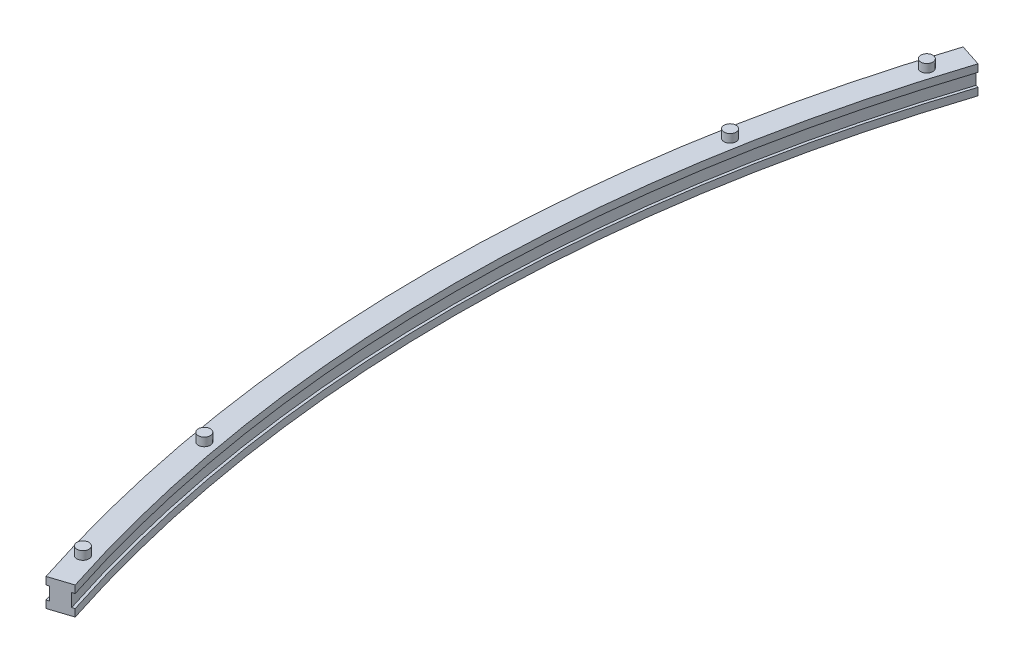
ISO-10303-21;
HEADER;
FILE_DESCRIPTION(('STEP AP214'),'2;1');
FILE_NAME('part.step','',(''),(''),'','','');
FILE_SCHEMA(('AUTOMOTIVE_DESIGN { 1 0 10303 214 1 1 1 1 }'));
ENDSEC;
DATA;
#1=APPLICATION_CONTEXT('core data for automotive mechanical design processes');
#2=APPLICATION_PROTOCOL_DEFINITION('international standard','automotive_design',2000,#1);
#3=PRODUCT_CONTEXT('',#1,'mechanical');
#4=PRODUCT('Part','Part','',(#3));
#5=PRODUCT_RELATED_PRODUCT_CATEGORY('part','',(#4));
#6=PRODUCT_DEFINITION_FORMATION('','',#4);
#7=PRODUCT_DEFINITION_CONTEXT('part definition',#1,'design');
#8=PRODUCT_DEFINITION('design','',#6,#7);
#9=PRODUCT_DEFINITION_SHAPE('','',#8);
#10=(LENGTH_UNIT() NAMED_UNIT(*) SI_UNIT(.MILLI.,.METRE.));
#11=(NAMED_UNIT(*) PLANE_ANGLE_UNIT() SI_UNIT($,.RADIAN.));
#12=(NAMED_UNIT(*) SI_UNIT($,.STERADIAN.) SOLID_ANGLE_UNIT());
#13=UNCERTAINTY_MEASURE_WITH_UNIT(LENGTH_MEASURE(1.E-05),#10,'distance_accuracy_value','');
#14=(GEOMETRIC_REPRESENTATION_CONTEXT(3) GLOBAL_UNCERTAINTY_ASSIGNED_CONTEXT((#13)) GLOBAL_UNIT_ASSIGNED_CONTEXT((#10,
#11,#12)) REPRESENTATION_CONTEXT('',''));
#15=CARTESIAN_POINT('',(0.,0.,0.));
#16=DIRECTION('',(0.,0.,1.));
#17=DIRECTION('',(1.,0.,0.));
#18=AXIS2_PLACEMENT_3D('',#15,#16,#17);
#19=CARTESIAN_POINT('',(0.,0.8,0.));
#20=DIRECTION('',(0.,1.,0.));
#21=DIRECTION('',(0.,0.,1.));
#22=AXIS2_PLACEMENT_3D('',#19,#20,#21);
#23=PLANE('',#22);
#24=CARTESIAN_POINT('',(0.,0.8,0.));
#25=DIRECTION('',(0.,-1.,0.));
#26=DIRECTION('',(0.,0.,1.));
#27=AXIS2_PLACEMENT_3D('',#24,#25,#26);
#28=CIRCLE('',#27,157.905734252812);
#29=CARTESIAN_POINT('',(-150.177277521508,0.8,48.7955553933733));
#30=VERTEX_POINT('',#29);
#31=CARTESIAN_POINT('',(-150.177277521508,0.8,-48.7955553933733));
#32=VERTEX_POINT('',#31);
#33=EDGE_CURVE('E52',#30,#32,#28,.T.);
#34=ORIENTED_EDGE('',*,*,#33,.F.);
#35=DIRECTION('',(-0.951056516295153,0.,0.309016994374949));
#36=VECTOR('',#35,1.);
#37=CARTESIAN_POINT('',(0.,0.8,0.));
#38=LINE('',#37,#36);
#39=CARTESIAN_POINT('',(-149.891960566619,0.8,48.7028502950608));
#40=VERTEX_POINT('',#39);
#41=EDGE_CURVE('E189',#40,#30,#38,.T.);
#42=ORIENTED_EDGE('',*,*,#41,.F.);
#43=CARTESIAN_POINT('',(0.,0.8,0.));
#44=DIRECTION('',(0.,1.,0.));
#45=DIRECTION('',(0.,0.,1.));
#46=AXIS2_PLACEMENT_3D('',#43,#44,#45);
#47=CIRCLE('',#46,157.605734252812);
#48=CARTESIAN_POINT('',(-149.891960566619,0.8,-48.7028502950608));
#49=VERTEX_POINT('',#48);
#50=EDGE_CURVE('E178',#49,#40,#47,.T.);
#51=ORIENTED_EDGE('',*,*,#50,.F.);
#52=DIRECTION('',(-0.951056516295153,0.,-0.309016994374949));
#53=VECTOR('',#52,1.);
#54=CARTESIAN_POINT('',(0.,0.8,0.));
#55=LINE('',#54,#53);
#56=EDGE_CURVE('E183',#49,#32,#55,.T.);
#57=ORIENTED_EDGE('',*,*,#56,.T.);
#58=EDGE_LOOP('',(#34,#42,#51,#57));
#59=FACE_BOUND('',#58,.T.);
#60=ADVANCED_FACE('F35',(#59),#23,.T.);
#61=CARTESIAN_POINT('',(0.,0.8,0.));
#62=DIRECTION('',(0.,-1.,0.));
#63=DIRECTION('',(0.,0.,-1.));
#64=AXIS2_PLACEMENT_3D('',#61,#62,#63);
#65=CYLINDRICAL_SURFACE('',#64,157.605734252812);
#66=CARTESIAN_POINT('',(0.,0.,0.));
#67=DIRECTION('',(0.,1.,0.));
#68=DIRECTION('',(0.,0.,1.));
#69=AXIS2_PLACEMENT_3D('',#66,#67,#68);
#70=CIRCLE('',#69,157.605734252812);
#71=CARTESIAN_POINT('',(-149.891960566619,0.,-48.7028502950608));
#72=VERTEX_POINT('',#71);
#73=CARTESIAN_POINT('',(-149.891960566619,0.,48.7028502950608));
#74=VERTEX_POINT('',#73);
#75=EDGE_CURVE('E177',#72,#74,#70,.T.);
#76=ORIENTED_EDGE('',*,*,#75,.F.);
#77=DIRECTION('',(0.,-1.,0.));
#78=VECTOR('',#77,1.);
#79=CARTESIAN_POINT('',(-149.891960566619,0.8,-48.7028502950608));
#80=LINE('',#79,#78);
#81=EDGE_CURVE('E11',#49,#72,#80,.T.);
#82=ORIENTED_EDGE('',*,*,#81,.F.);
#83=ORIENTED_EDGE('',*,*,#50,.T.);
#84=DIRECTION('',(0.,-1.,0.));
#85=VECTOR('',#84,1.);
#86=CARTESIAN_POINT('',(-149.891960566619,0.8,48.7028502950608));
#87=LINE('',#86,#85);
#88=EDGE_CURVE('E191',#40,#74,#87,.T.);
#89=ORIENTED_EDGE('',*,*,#88,.T.);
#90=EDGE_LOOP('',(#76,#82,#83,#89));
#91=FACE_BOUND('',#90,.T.);
#92=ADVANCED_FACE('F37',(#91),#65,.F.);
#93=CARTESIAN_POINT('',(0.,0.8,0.));
#94=DIRECTION('',(-0.309016994374949,0.,0.951056516295153));
#95=DIRECTION('',(0.951056516295153,0.,0.309016994374949));
#96=AXIS2_PLACEMENT_3D('',#93,#94,#95);
#97=PLANE('',#96);
#98=DIRECTION('',(-0.951056516295153,0.,-0.309016994374949));
#99=VECTOR('',#98,1.);
#100=CARTESIAN_POINT('',(0.,0.,0.));
#101=LINE('',#100,#99);
#102=CARTESIAN_POINT('',(-152.269601857357,0.,-49.4753927809982));
#103=VERTEX_POINT('',#102);
#104=EDGE_CURVE('E194',#72,#103,#101,.T.);
#105=ORIENTED_EDGE('',*,*,#104,.T.);
#106=DIRECTION('',(0.,-1.,0.));
#107=VECTOR('',#106,1.);
#108=CARTESIAN_POINT('',(-152.269601857357,0.8,-49.4753927809982));
#109=LINE('',#108,#107);
#110=CARTESIAN_POINT('',(-152.269601857357,0.8,-49.4753927809982));
#111=VERTEX_POINT('',#110);
#112=EDGE_CURVE('E44',#111,#103,#109,.T.);
#113=ORIENTED_EDGE('',*,*,#112,.F.);
#114=CARTESIAN_POINT('',(-151.984284902468,0.8,-49.3826876826857));
#115=VERTEX_POINT('',#114);
#116=EDGE_CURVE('E181',#115,#111,#55,.T.);
#117=ORIENTED_EDGE('',*,*,#116,.F.);
#118=DIRECTION('',(0.,-1.,0.));
#119=VECTOR('',#118,1.);
#120=CARTESIAN_POINT('',(-151.984284902468,2.2,-49.3826876826857));
#121=LINE('',#120,#119);
#122=CARTESIAN_POINT('',(-151.984284902468,2.2,-49.3826876826857));
#123=VERTEX_POINT('',#122);
#124=EDGE_CURVE('E171',#123,#115,#121,.T.);
#125=ORIENTED_EDGE('',*,*,#124,.F.);
#126=DIRECTION('',(-0.951056516295153,0.,-0.309016994374948));
#127=VECTOR('',#126,1.);
#128=CARTESIAN_POINT('',(-149.891960566619,2.2,-48.7028502950608));
#129=LINE('',#128,#127);
#130=CARTESIAN_POINT('',(-152.269601857357,2.2,-49.4753927809982));
#131=VERTEX_POINT('',#130);
#132=EDGE_CURVE('E234',#123,#131,#129,.T.);
#133=ORIENTED_EDGE('',*,*,#132,.T.);
#134=DIRECTION('',(0.,-1.,0.));
#135=VECTOR('',#134,1.);
#136=CARTESIAN_POINT('',(-152.269601857357,3.,-49.4753927809982));
#137=LINE('',#136,#135);
#138=CARTESIAN_POINT('',(-152.269601857357,3.,-49.4753927809982));
#139=VERTEX_POINT('',#138);
#140=EDGE_CURVE('E134',#139,#131,#137,.T.);
#141=ORIENTED_EDGE('',*,*,#140,.F.);
#142=DIRECTION('',(-0.951056516295153,0.,-0.309016994374948));
#143=VECTOR('',#142,1.);
#144=CARTESIAN_POINT('',(-149.891960566619,3.,-48.7028502950608));
#145=LINE('',#144,#143);
#146=CARTESIAN_POINT('',(-149.891960566619,3.,-48.7028502950608));
#147=VERTEX_POINT('',#146);
#148=EDGE_CURVE('E126',#147,#139,#145,.T.);
#149=ORIENTED_EDGE('',*,*,#148,.F.);
#150=DIRECTION('',(0.,-1.,0.));
#151=VECTOR('',#150,1.);
#152=CARTESIAN_POINT('',(-149.891960566619,3.,-48.7028502950608));
#153=LINE('',#152,#151);
#154=CARTESIAN_POINT('',(-149.891960566619,2.2,-48.7028502950608));
#155=VERTEX_POINT('',#154);
#156=EDGE_CURVE('E131',#147,#155,#153,.T.);
#157=ORIENTED_EDGE('',*,*,#156,.T.);
#158=CARTESIAN_POINT('',(-150.177277521508,2.2,-48.7955553933733));
#159=VERTEX_POINT('',#158);
#160=EDGE_CURVE('E235',#155,#159,#129,.T.);
#161=ORIENTED_EDGE('',*,*,#160,.T.);
#162=DIRECTION('',(0.,-1.,0.));
#163=VECTOR('',#162,1.);
#164=CARTESIAN_POINT('',(-150.177277521508,2.2,-48.7955553933733));
#165=LINE('',#164,#163);
#166=EDGE_CURVE('E174',#159,#32,#165,.T.);
#167=ORIENTED_EDGE('',*,*,#166,.T.);
#168=ORIENTED_EDGE('',*,*,#56,.F.);
#169=ORIENTED_EDGE('',*,*,#81,.T.);
#170=EDGE_LOOP('',(#105,#113,#117,#125,#133,#141,#149,#157,#161,#167,#168,#169));
#171=FACE_BOUND('',#170,.T.);
#172=ADVANCED_FACE('F128',(#171),#97,.F.);
#173=CARTESIAN_POINT('',(0.,0.8,0.));
#174=DIRECTION('',(0.,-1.,0.));
#175=DIRECTION('',(0.,0.,-1.));
#176=AXIS2_PLACEMENT_3D('',#173,#174,#175);
#177=CYLINDRICAL_SURFACE('',#176,160.105734252812);
#178=CARTESIAN_POINT('',(0.,0.,0.));
#179=DIRECTION('',(0.,1.,0.));
#180=DIRECTION('',(0.,0.,1.));
#181=AXIS2_PLACEMENT_3D('',#178,#179,#180);
#182=CIRCLE('',#181,160.105734252812);
#183=CARTESIAN_POINT('',(-152.269601857357,0.,49.4753927809982));
#184=VERTEX_POINT('',#183);
#185=EDGE_CURVE('E196',#103,#184,#182,.T.);
#186=ORIENTED_EDGE('',*,*,#185,.T.);
#187=DIRECTION('',(0.,-1.,0.));
#188=VECTOR('',#187,1.);
#189=CARTESIAN_POINT('',(-152.269601857357,0.8,49.4753927809982));
#190=LINE('',#189,#188);
#191=CARTESIAN_POINT('',(-152.269601857357,0.8,49.4753927809982));
#192=VERTEX_POINT('',#191);
#193=EDGE_CURVE('E202',#192,#184,#190,.T.);
#194=ORIENTED_EDGE('',*,*,#193,.F.);
#195=CARTESIAN_POINT('',(0.,0.8,0.));
#196=DIRECTION('',(0.,1.,0.));
#197=DIRECTION('',(0.,0.,1.));
#198=AXIS2_PLACEMENT_3D('',#195,#196,#197);
#199=CIRCLE('',#198,160.105734252812);
#200=EDGE_CURVE('E185',#111,#192,#199,.T.);
#201=ORIENTED_EDGE('',*,*,#200,.F.);
#202=ORIENTED_EDGE('',*,*,#112,.T.);
#203=EDGE_LOOP('',(#186,#194,#201,#202));
#204=FACE_BOUND('',#203,.T.);
#205=ADVANCED_FACE('F261',(#204),#177,.T.);
#206=CARTESIAN_POINT('',(0.,0.8,0.));
#207=DIRECTION('',(0.309016994374949,0.,0.951056516295153));
#208=DIRECTION('',(0.951056516295153,0.,-0.309016994374949));
#209=AXIS2_PLACEMENT_3D('',#206,#207,#208);
#210=PLANE('',#209);
#211=DIRECTION('',(-0.951056516295153,0.,0.309016994374949));
#212=VECTOR('',#211,1.);
#213=CARTESIAN_POINT('',(0.,0.,0.));
#214=LINE('',#213,#212);
#215=EDGE_CURVE('E182',#74,#184,#214,.T.);
#216=ORIENTED_EDGE('',*,*,#215,.F.);
#217=ORIENTED_EDGE('',*,*,#88,.F.);
#218=ORIENTED_EDGE('',*,*,#41,.T.);
#219=DIRECTION('',(0.,-1.,0.));
#220=VECTOR('',#219,1.);
#221=CARTESIAN_POINT('',(-150.177277521508,2.2,48.7955553933732));
#222=LINE('',#221,#220);
#223=CARTESIAN_POINT('',(-150.177277521508,2.2,48.7955553933732));
#224=VERTEX_POINT('',#223);
#225=EDGE_CURVE('E163',#224,#30,#222,.T.);
#226=ORIENTED_EDGE('',*,*,#225,.F.);
#227=DIRECTION('',(0.951056516295149,0.,-0.30901699437496));
#228=VECTOR('',#227,1.);
#229=CARTESIAN_POINT('',(-152.269601857357,2.2,49.4753927809982));
#230=LINE('',#229,#228);
#231=CARTESIAN_POINT('',(-149.891960566619,2.2,48.7028502950608));
#232=VERTEX_POINT('',#231);
#233=EDGE_CURVE('E239',#224,#232,#230,.T.);
#234=ORIENTED_EDGE('',*,*,#233,.T.);
#235=DIRECTION('',(0.,-1.,0.));
#236=VECTOR('',#235,1.);
#237=CARTESIAN_POINT('',(-149.891960566619,3.,48.7028502950608));
#238=LINE('',#237,#236);
#239=CARTESIAN_POINT('',(-149.891960566619,3.,48.7028502950608));
#240=VERTEX_POINT('',#239);
#241=EDGE_CURVE('E232',#240,#232,#238,.T.);
#242=ORIENTED_EDGE('',*,*,#241,.F.);
#243=DIRECTION('',(0.951056516295149,0.,-0.30901699437496));
#244=VECTOR('',#243,1.);
#245=CARTESIAN_POINT('',(-152.269601857357,3.,49.4753927809982));
#246=LINE('',#245,#244);
#247=CARTESIAN_POINT('',(-152.269601857357,3.,49.4753927809982));
#248=VERTEX_POINT('',#247);
#249=EDGE_CURVE('E143',#248,#240,#246,.T.);
#250=ORIENTED_EDGE('',*,*,#249,.F.);
#251=DIRECTION('',(0.,-1.,0.));
#252=VECTOR('',#251,1.);
#253=CARTESIAN_POINT('',(-152.269601857357,3.,49.4753927809982));
#254=LINE('',#253,#252);
#255=CARTESIAN_POINT('',(-152.269601857357,2.2,49.4753927809982));
#256=VERTEX_POINT('',#255);
#257=EDGE_CURVE('E154',#248,#256,#254,.T.);
#258=ORIENTED_EDGE('',*,*,#257,.T.);
#259=CARTESIAN_POINT('',(-151.984284902468,2.2,49.3826876826857));
#260=VERTEX_POINT('',#259);
#261=EDGE_CURVE('E147',#256,#260,#230,.T.);
#262=ORIENTED_EDGE('',*,*,#261,.T.);
#263=DIRECTION('',(0.,-1.,0.));
#264=VECTOR('',#263,1.);
#265=CARTESIAN_POINT('',(-151.984284902468,2.2,49.3826876826856));
#266=LINE('',#265,#264);
#267=CARTESIAN_POINT('',(-151.984284902468,0.8,49.3826876826856));
#268=VERTEX_POINT('',#267);
#269=EDGE_CURVE('E168',#260,#268,#266,.T.);
#270=ORIENTED_EDGE('',*,*,#269,.T.);
#271=EDGE_CURVE('E188',#268,#192,#38,.T.);
#272=ORIENTED_EDGE('',*,*,#271,.T.);
#273=ORIENTED_EDGE('',*,*,#193,.T.);
#274=EDGE_LOOP('',(#216,#217,#218,#226,#234,#242,#250,#258,#262,#270,#272,#273));
#275=FACE_BOUND('',#274,.T.);
#276=ADVANCED_FACE('F247',(#275),#210,.T.);
#277=CARTESIAN_POINT('',(0.,0.8,0.));
#278=DIRECTION('',(0.,1.,0.));
#279=DIRECTION('',(0.,0.,1.));
#280=AXIS2_PLACEMENT_3D('',#277,#278,#279);
#281=CIRCLE('',#280,159.805734252812);
#282=EDGE_CURVE('E60',#115,#268,#281,.T.);
#283=ORIENTED_EDGE('',*,*,#282,.F.);
#284=ORIENTED_EDGE('',*,*,#116,.T.);
#285=ORIENTED_EDGE('',*,*,#200,.T.);
#286=ORIENTED_EDGE('',*,*,#271,.F.);
#287=EDGE_LOOP('',(#283,#284,#285,#286));
#288=FACE_BOUND('',#287,.T.);
#289=ADVANCED_FACE('F258',(#288),#23,.T.);
#290=CARTESIAN_POINT('',(0.,0.,0.));
#291=DIRECTION('',(0.,1.,0.));
#292=DIRECTION('',(0.,0.,1.));
#293=AXIS2_PLACEMENT_3D('',#290,#291,#292);
#294=PLANE('',#293);
#295=ORIENTED_EDGE('',*,*,#75,.T.);
#296=ORIENTED_EDGE('',*,*,#215,.T.);
#297=ORIENTED_EDGE('',*,*,#185,.F.);
#298=ORIENTED_EDGE('',*,*,#104,.F.);
#299=EDGE_LOOP('',(#295,#296,#297,#298));
#300=FACE_BOUND('',#299,.T.);
#301=ADVANCED_FACE('F265',(#300),#294,.F.);
#302=CARTESIAN_POINT('',(0.,2.2,0.));
#303=DIRECTION('',(0.,-1.,0.));
#304=DIRECTION('',(0.,0.,-1.));
#305=AXIS2_PLACEMENT_3D('',#302,#303,#304);
#306=CYLINDRICAL_SURFACE('',#305,157.905734252812);
#307=ORIENTED_EDGE('',*,*,#33,.T.);
#308=ORIENTED_EDGE('',*,*,#166,.F.);
#309=CARTESIAN_POINT('',(0.,2.2,0.));
#310=DIRECTION('',(0.,-1.,0.));
#311=DIRECTION('',(0.,0.,1.));
#312=AXIS2_PLACEMENT_3D('',#309,#310,#311);
#313=CIRCLE('',#312,157.905734252812);
#314=EDGE_CURVE('E158',#224,#159,#313,.T.);
#315=ORIENTED_EDGE('',*,*,#314,.F.);
#316=ORIENTED_EDGE('',*,*,#225,.T.);
#317=EDGE_LOOP('',(#307,#308,#315,#316));
#318=FACE_BOUND('',#317,.T.);
#319=ADVANCED_FACE('F282',(#318),#306,.F.);
#320=CARTESIAN_POINT('',(0.,2.2,0.));
#321=DIRECTION('',(0.,-1.,0.));
#322=DIRECTION('',(0.,0.,-1.));
#323=AXIS2_PLACEMENT_3D('',#320,#321,#322);
#324=CYLINDRICAL_SURFACE('',#323,159.805734252812);
#325=ORIENTED_EDGE('',*,*,#282,.T.);
#326=ORIENTED_EDGE('',*,*,#269,.F.);
#327=CARTESIAN_POINT('',(0.,2.2,0.));
#328=DIRECTION('',(0.,1.,0.));
#329=DIRECTION('',(0.,0.,1.));
#330=AXIS2_PLACEMENT_3D('',#327,#328,#329);
#331=CIRCLE('',#330,159.805734252812);
#332=EDGE_CURVE('E161',#123,#260,#331,.T.);
#333=ORIENTED_EDGE('',*,*,#332,.F.);
#334=ORIENTED_EDGE('',*,*,#124,.T.);
#335=EDGE_LOOP('',(#325,#326,#333,#334));
#336=FACE_BOUND('',#335,.T.);
#337=ADVANCED_FACE('F255',(#336),#324,.T.);
#338=CARTESIAN_POINT('',(0.,2.2,0.));
#339=DIRECTION('',(0.,1.,0.));
#340=DIRECTION('',(0.,0.,1.));
#341=AXIS2_PLACEMENT_3D('',#338,#339,#340);
#342=PLANE('',#341);
#343=ORIENTED_EDGE('',*,*,#233,.F.);
#344=ORIENTED_EDGE('',*,*,#314,.T.);
#345=ORIENTED_EDGE('',*,*,#160,.F.);
#346=CARTESIAN_POINT('',(0.,2.2,0.));
#347=DIRECTION('',(0.,-1.,0.));
#348=DIRECTION('',(0.,0.,1.));
#349=AXIS2_PLACEMENT_3D('',#346,#347,#348);
#350=CIRCLE('',#349,157.605734252812);
#351=EDGE_CURVE('E151',#232,#155,#350,.T.);
#352=ORIENTED_EDGE('',*,*,#351,.F.);
#353=EDGE_LOOP('',(#343,#344,#345,#352));
#354=FACE_BOUND('',#353,.T.);
#355=ADVANCED_FACE('F423',(#354),#342,.F.);
#356=CARTESIAN_POINT('',(0.,3.,0.));
#357=DIRECTION('',(0.,-1.,0.));
#358=DIRECTION('',(0.,0.,-1.));
#359=AXIS2_PLACEMENT_3D('',#356,#357,#358);
#360=CYLINDRICAL_SURFACE('',#359,157.605734252812);
#361=ORIENTED_EDGE('',*,*,#351,.T.);
#362=ORIENTED_EDGE('',*,*,#156,.F.);
#363=CARTESIAN_POINT('',(0.,3.,0.));
#364=DIRECTION('',(0.,-1.,0.));
#365=DIRECTION('',(0.,0.,1.));
#366=AXIS2_PLACEMENT_3D('',#363,#364,#365);
#367=CIRCLE('',#366,157.605734252812);
#368=EDGE_CURVE('E138',#240,#147,#367,.T.);
#369=ORIENTED_EDGE('',*,*,#368,.F.);
#370=ORIENTED_EDGE('',*,*,#241,.T.);
#371=EDGE_LOOP('',(#361,#362,#369,#370));
#372=FACE_BOUND('',#371,.T.);
#373=ADVANCED_FACE('F149',(#372),#360,.F.);
#374=CARTESIAN_POINT('',(0.,3.,0.));
#375=DIRECTION('',(0.,-1.,0.));
#376=DIRECTION('',(0.,0.,-1.));
#377=AXIS2_PLACEMENT_3D('',#374,#375,#376);
#378=CYLINDRICAL_SURFACE('',#377,160.105734252812);
#379=CARTESIAN_POINT('',(0.,2.2,0.));
#380=DIRECTION('',(0.,1.,0.));
#381=DIRECTION('',(0.,0.,1.));
#382=AXIS2_PLACEMENT_3D('',#379,#380,#381);
#383=CIRCLE('',#382,160.105734252812);
#384=EDGE_CURVE('E237',#131,#256,#383,.T.);
#385=ORIENTED_EDGE('',*,*,#384,.T.);
#386=ORIENTED_EDGE('',*,*,#257,.F.);
#387=CARTESIAN_POINT('',(0.,3.,0.));
#388=DIRECTION('',(0.,1.,0.));
#389=DIRECTION('',(0.,0.,1.));
#390=AXIS2_PLACEMENT_3D('',#387,#388,#389);
#391=CIRCLE('',#390,160.105734252812);
#392=EDGE_CURVE('E137',#139,#248,#391,.T.);
#393=ORIENTED_EDGE('',*,*,#392,.F.);
#394=ORIENTED_EDGE('',*,*,#140,.T.);
#395=EDGE_LOOP('',(#385,#386,#393,#394));
#396=FACE_BOUND('',#395,.T.);
#397=ADVANCED_FACE('F334',(#396),#378,.T.);
#398=CARTESIAN_POINT('',(0.,3.,0.));
#399=DIRECTION('',(0.,1.,0.));
#400=DIRECTION('',(0.,0.,1.));
#401=AXIS2_PLACEMENT_3D('',#398,#399,#400);
#402=PLANE('',#401);
#403=CARTESIAN_POINT('',(-156.303,3.,-28.364));
#404=DIRECTION('',(0.,1.,0.));
#405=DIRECTION('',(0.,0.,1.));
#406=AXIS2_PLACEMENT_3D('',#403,#404,#405);
#407=CIRCLE('',#406,0.650000000000019);
#408=CARTESIAN_POINT('',(-156.303,3.,-27.714));
#409=VERTEX_POINT('',#408);
#410=EDGE_CURVE('E39',#409,#409,#407,.F.);
#411=ORIENTED_EDGE('',*,*,#410,.T.);
#412=EDGE_LOOP('',(#411));
#413=FACE_BOUND('',#412,.T.);
#414=CARTESIAN_POINT('',(-152.239,3.,45.522));
#415=DIRECTION('',(0.,1.,0.));
#416=DIRECTION('',(0.,0.,1.));
#417=AXIS2_PLACEMENT_3D('',#414,#415,#416);
#418=CIRCLE('',#417,0.650000000000019);
#419=CARTESIAN_POINT('',(-152.239,3.,46.172));
#420=VERTEX_POINT('',#419);
#421=EDGE_CURVE('E213',#420,#420,#418,.F.);
#422=ORIENTED_EDGE('',*,*,#421,.T.);
#423=EDGE_LOOP('',(#422));
#424=FACE_BOUND('',#423,.T.);
#425=CARTESIAN_POINT('',(-152.239,3.,-45.522));
#426=DIRECTION('',(0.,1.,0.));
#427=DIRECTION('',(0.,0.,1.));
#428=AXIS2_PLACEMENT_3D('',#425,#426,#427);
#429=CIRCLE('',#428,0.650000000000019);
#430=CARTESIAN_POINT('',(-152.239,3.,-44.872));
#431=VERTEX_POINT('',#430);
#432=EDGE_CURVE('E210',#431,#431,#429,.F.);
#433=ORIENTED_EDGE('',*,*,#432,.T.);
#434=EDGE_LOOP('',(#433));
#435=FACE_BOUND('',#434,.T.);
#436=CARTESIAN_POINT('',(-156.303,3.,28.364));
#437=DIRECTION('',(0.,1.,0.));
#438=DIRECTION('',(0.,0.,1.));
#439=AXIS2_PLACEMENT_3D('',#436,#437,#438);
#440=CIRCLE('',#439,0.650000000000019);
#441=CARTESIAN_POINT('',(-156.303,3.,29.014));
#442=VERTEX_POINT('',#441);
#443=EDGE_CURVE('E206',#442,#442,#440,.F.);
#444=ORIENTED_EDGE('',*,*,#443,.T.);
#445=EDGE_LOOP('',(#444));
#446=FACE_BOUND('',#445,.T.);
#447=ORIENTED_EDGE('',*,*,#368,.T.);
#448=ORIENTED_EDGE('',*,*,#148,.T.);
#449=ORIENTED_EDGE('',*,*,#392,.T.);
#450=ORIENTED_EDGE('',*,*,#249,.T.);
#451=EDGE_LOOP('',(#447,#448,#449,#450));
#452=FACE_BOUND('',#451,.T.);
#453=ADVANCED_FACE('F141',(#413,#424,#435,#446,#452),#402,.T.);
#454=ORIENTED_EDGE('',*,*,#132,.F.);
#455=ORIENTED_EDGE('',*,*,#332,.T.);
#456=ORIENTED_EDGE('',*,*,#261,.F.);
#457=ORIENTED_EDGE('',*,*,#384,.F.);
#458=EDGE_LOOP('',(#454,#455,#456,#457));
#459=FACE_BOUND('',#458,.T.);
#460=ADVANCED_FACE('F252',(#459),#342,.F.);
#461=CARTESIAN_POINT('',(-156.303,3.9,28.364));
#462=DIRECTION('',(0.,-1.,0.));
#463=DIRECTION('',(0.,0.,-1.));
#464=AXIS2_PLACEMENT_3D('',#461,#462,#463);
#465=CYLINDRICAL_SURFACE('',#464,0.650000000000019);
#466=ORIENTED_EDGE('',*,*,#443,.F.);
#467=EDGE_LOOP('',(#466));
#468=FACE_BOUND('',#467,.T.);
#469=CARTESIAN_POINT('',(-156.303,3.9,28.364));
#470=DIRECTION('',(0.,1.,0.));
#471=DIRECTION('',(0.,0.,1.));
#472=AXIS2_PLACEMENT_3D('',#469,#470,#471);
#473=CIRCLE('',#472,0.650000000000019);
#474=CARTESIAN_POINT('',(-156.303,3.9,29.014));
#475=VERTEX_POINT('',#474);
#476=EDGE_CURVE('E209',#475,#475,#473,.T.);
#477=ORIENTED_EDGE('',*,*,#476,.F.);
#478=EDGE_LOOP('',(#477));
#479=FACE_BOUND('',#478,.T.);
#480=ADVANCED_FACE('F342',(#468,#479),#465,.T.);
#481=CARTESIAN_POINT('',(0.,3.9,0.));
#482=DIRECTION('',(0.,1.,0.));
#483=DIRECTION('',(0.,0.,1.));
#484=AXIS2_PLACEMENT_3D('',#481,#482,#483);
#485=PLANE('',#484);
#486=ORIENTED_EDGE('',*,*,#476,.T.);
#487=EDGE_LOOP('',(#486));
#488=FACE_BOUND('',#487,.T.);
#489=ADVANCED_FACE('F347',(#488),#485,.T.);
#490=CARTESIAN_POINT('',(-152.239,3.9,-45.522));
#491=DIRECTION('',(0.,-1.,0.));
#492=DIRECTION('',(0.,0.,-1.));
#493=AXIS2_PLACEMENT_3D('',#490,#491,#492);
#494=CYLINDRICAL_SURFACE('',#493,0.650000000000019);
#495=ORIENTED_EDGE('',*,*,#432,.F.);
#496=EDGE_LOOP('',(#495));
#497=FACE_BOUND('',#496,.T.);
#498=CARTESIAN_POINT('',(-152.239,3.9,-45.522));
#499=DIRECTION('',(0.,1.,0.));
#500=DIRECTION('',(0.,0.,1.));
#501=AXIS2_PLACEMENT_3D('',#498,#499,#500);
#502=CIRCLE('',#501,0.650000000000019);
#503=CARTESIAN_POINT('',(-152.239,3.9,-44.872));
#504=VERTEX_POINT('',#503);
#505=EDGE_CURVE('E212',#504,#504,#502,.T.);
#506=ORIENTED_EDGE('',*,*,#505,.F.);
#507=EDGE_LOOP('',(#506));
#508=FACE_BOUND('',#507,.T.);
#509=ADVANCED_FACE('F357',(#497,#508),#494,.T.);
#510=CARTESIAN_POINT('',(0.,3.9,0.));
#511=DIRECTION('',(0.,1.,0.));
#512=DIRECTION('',(0.,0.,1.));
#513=AXIS2_PLACEMENT_3D('',#510,#511,#512);
#514=PLANE('',#513);
#515=ORIENTED_EDGE('',*,*,#505,.T.);
#516=EDGE_LOOP('',(#515));
#517=FACE_BOUND('',#516,.T.);
#518=ADVANCED_FACE('F367',(#517),#514,.T.);
#519=CARTESIAN_POINT('',(-152.239,3.9,45.522));
#520=DIRECTION('',(0.,-1.,0.));
#521=DIRECTION('',(0.,0.,-1.));
#522=AXIS2_PLACEMENT_3D('',#519,#520,#521);
#523=CYLINDRICAL_SURFACE('',#522,0.650000000000019);
#524=ORIENTED_EDGE('',*,*,#421,.F.);
#525=EDGE_LOOP('',(#524));
#526=FACE_BOUND('',#525,.T.);
#527=CARTESIAN_POINT('',(-152.239,3.9,45.522));
#528=DIRECTION('',(0.,1.,0.));
#529=DIRECTION('',(0.,0.,1.));
#530=AXIS2_PLACEMENT_3D('',#527,#528,#529);
#531=CIRCLE('',#530,0.650000000000019);
#532=CARTESIAN_POINT('',(-152.239,3.9,46.172));
#533=VERTEX_POINT('',#532);
#534=EDGE_CURVE('E215',#533,#533,#531,.T.);
#535=ORIENTED_EDGE('',*,*,#534,.F.);
#536=EDGE_LOOP('',(#535));
#537=FACE_BOUND('',#536,.T.);
#538=ADVANCED_FACE('F377',(#526,#537),#523,.T.);
#539=CARTESIAN_POINT('',(-152.239,3.9,45.522));
#540=DIRECTION('',(0.,1.,0.));
#541=DIRECTION('',(0.,0.,1.));
#542=AXIS2_PLACEMENT_3D('',#539,#540,#541);
#543=PLANE('',#542);
#544=ORIENTED_EDGE('',*,*,#534,.T.);
#545=EDGE_LOOP('',(#544));
#546=FACE_BOUND('',#545,.T.);
#547=ADVANCED_FACE('F387',(#546),#543,.T.);
#548=CARTESIAN_POINT('',(-156.303,3.9,-28.364));
#549=DIRECTION('',(0.,-1.,0.));
#550=DIRECTION('',(0.,0.,-1.));
#551=AXIS2_PLACEMENT_3D('',#548,#549,#550);
#552=CYLINDRICAL_SURFACE('',#551,0.650000000000019);
#553=ORIENTED_EDGE('',*,*,#410,.F.);
#554=EDGE_LOOP('',(#553));
#555=FACE_BOUND('',#554,.T.);
#556=CARTESIAN_POINT('',(-156.303,3.9,-28.364));
#557=DIRECTION('',(0.,1.,0.));
#558=DIRECTION('',(0.,0.,1.));
#559=AXIS2_PLACEMENT_3D('',#556,#557,#558);
#560=CIRCLE('',#559,0.650000000000019);
#561=CARTESIAN_POINT('',(-156.303,3.9,-27.714));
#562=VERTEX_POINT('',#561);
#563=EDGE_CURVE('E225',#562,#562,#560,.T.);
#564=ORIENTED_EDGE('',*,*,#563,.F.);
#565=EDGE_LOOP('',(#564));
#566=FACE_BOUND('',#565,.T.);
#567=ADVANCED_FACE('F397',(#555,#566),#552,.T.);
#568=CARTESIAN_POINT('',(-156.303,3.9,-28.364));
#569=DIRECTION('',(0.,1.,0.));
#570=DIRECTION('',(0.,0.,1.));
#571=AXIS2_PLACEMENT_3D('',#568,#569,#570);
#572=PLANE('',#571);
#573=ORIENTED_EDGE('',*,*,#563,.T.);
#574=EDGE_LOOP('',(#573));
#575=FACE_BOUND('',#574,.T.);
#576=ADVANCED_FACE('F406',(#575),#572,.T.);
#577=CLOSED_SHELL('',(#60,#92,#172,#205,#276,#289,#301,#319,#337,#355,#373,#397,#453,#460,#480,
#489,#509,#518,#538,#547,#567,#576));
#578=MANIFOLD_SOLID_BREP('B2',#577);
#579=ADVANCED_BREP_SHAPE_REPRESENTATION('',(#18,#578),#14);
#580=SHAPE_DEFINITION_REPRESENTATION(#9,#579);
ENDSEC;
END-ISO-10303-21;
